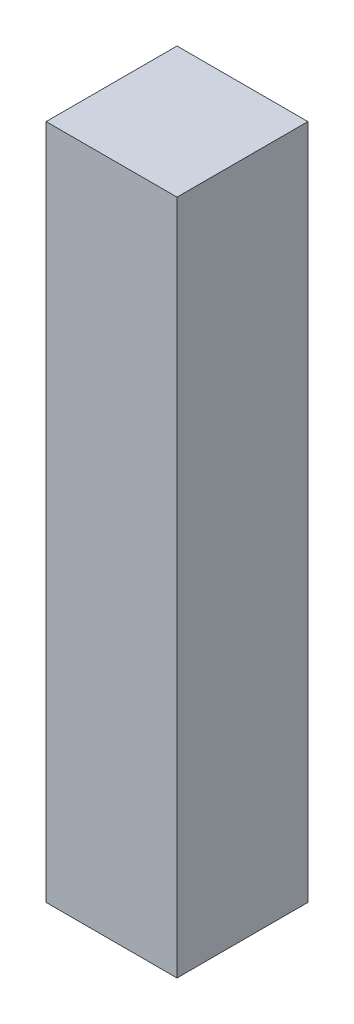
ISO-10303-21;
HEADER;
FILE_DESCRIPTION(('STEP AP214'),'2;1');
FILE_NAME('part.step','',(''),(''),'','','');
FILE_SCHEMA(('AUTOMOTIVE_DESIGN { 1 0 10303 214 1 1 1 1 }'));
ENDSEC;
DATA;
#1=APPLICATION_CONTEXT('core data for automotive mechanical design processes');
#2=APPLICATION_PROTOCOL_DEFINITION('international standard','automotive_design',2000,#1);
#3=PRODUCT_CONTEXT('',#1,'mechanical');
#4=PRODUCT('Part','Part','',(#3));
#5=PRODUCT_RELATED_PRODUCT_CATEGORY('part','',(#4));
#6=PRODUCT_DEFINITION_FORMATION('','',#4);
#7=PRODUCT_DEFINITION_CONTEXT('part definition',#1,'design');
#8=PRODUCT_DEFINITION('design','',#6,#7);
#9=PRODUCT_DEFINITION_SHAPE('','',#8);
#10=(LENGTH_UNIT() NAMED_UNIT(*) SI_UNIT(.MILLI.,.METRE.));
#11=(NAMED_UNIT(*) PLANE_ANGLE_UNIT() SI_UNIT($,.RADIAN.));
#12=(NAMED_UNIT(*) SI_UNIT($,.STERADIAN.) SOLID_ANGLE_UNIT());
#13=UNCERTAINTY_MEASURE_WITH_UNIT(LENGTH_MEASURE(1.E-05),#10,'distance_accuracy_value','');
#14=(GEOMETRIC_REPRESENTATION_CONTEXT(3) GLOBAL_UNCERTAINTY_ASSIGNED_CONTEXT((#13)) GLOBAL_UNIT_ASSIGNED_CONTEXT((#10,
#11,#12)) REPRESENTATION_CONTEXT('',''));
#15=CARTESIAN_POINT('',(0.,0.,0.));
#16=DIRECTION('',(0.,0.,1.));
#17=DIRECTION('',(1.,0.,0.));
#18=AXIS2_PLACEMENT_3D('',#15,#16,#17);
#19=CARTESIAN_POINT('',(0.,98.425,0.));
#20=DIRECTION('',(1.,0.,0.));
#21=DIRECTION('',(0.,0.,-1.));
#22=AXIS2_PLACEMENT_3D('',#19,#20,#21);
#23=PLANE('',#22);
#24=DIRECTION('',(0.,0.,1.));
#25=VECTOR('',#24,1.);
#26=CARTESIAN_POINT('',(0.,0.,0.));
#27=LINE('',#26,#25);
#28=CARTESIAN_POINT('',(0.,0.,-19.05));
#29=VERTEX_POINT('',#28);
#30=CARTESIAN_POINT('',(0.,0.,0.));
#31=VERTEX_POINT('',#30);
#32=EDGE_CURVE('E98',#29,#31,#27,.T.);
#33=ORIENTED_EDGE('',*,*,#32,.T.);
#34=DIRECTION('',(0.,-1.,0.));
#35=VECTOR('',#34,1.);
#36=CARTESIAN_POINT('',(0.,98.425,0.));
#37=LINE('',#36,#35);
#38=CARTESIAN_POINT('',(0.,98.425,0.));
#39=VERTEX_POINT('',#38);
#40=EDGE_CURVE('E11',#39,#31,#37,.T.);
#41=ORIENTED_EDGE('',*,*,#40,.F.);
#42=DIRECTION('',(0.,0.,1.));
#43=VECTOR('',#42,1.);
#44=CARTESIAN_POINT('',(0.,98.425,0.));
#45=LINE('',#44,#43);
#46=CARTESIAN_POINT('',(0.,98.425,-19.05));
#47=VERTEX_POINT('',#46);
#48=EDGE_CURVE('E86',#47,#39,#45,.T.);
#49=ORIENTED_EDGE('',*,*,#48,.F.);
#50=DIRECTION('',(0.,-1.,0.));
#51=VECTOR('',#50,1.);
#52=CARTESIAN_POINT('',(0.,98.425,-19.05));
#53=LINE('',#52,#51);
#54=EDGE_CURVE('E94',#47,#29,#53,.T.);
#55=ORIENTED_EDGE('',*,*,#54,.T.);
#56=EDGE_LOOP('',(#33,#41,#49,#55));
#57=FACE_BOUND('',#56,.T.);
#58=ADVANCED_FACE('F35',(#57),#23,.F.);
#59=CARTESIAN_POINT('',(0.,98.425,0.));
#60=DIRECTION('',(0.,0.,-1.));
#61=DIRECTION('',(-1.,0.,0.));
#62=AXIS2_PLACEMENT_3D('',#59,#60,#61);
#63=PLANE('',#62);
#64=DIRECTION('',(1.,0.,0.));
#65=VECTOR('',#64,1.);
#66=CARTESIAN_POINT('',(0.,0.,0.));
#67=LINE('',#66,#65);
#68=CARTESIAN_POINT('',(19.05,0.,0.));
#69=VERTEX_POINT('',#68);
#70=EDGE_CURVE('E90',#31,#69,#67,.T.);
#71=ORIENTED_EDGE('',*,*,#70,.T.);
#72=DIRECTION('',(0.,-1.,0.));
#73=VECTOR('',#72,1.);
#74=CARTESIAN_POINT('',(19.05,98.425,0.));
#75=LINE('',#74,#73);
#76=CARTESIAN_POINT('',(19.05,98.425,0.));
#77=VERTEX_POINT('',#76);
#78=EDGE_CURVE('E43',#77,#69,#75,.T.);
#79=ORIENTED_EDGE('',*,*,#78,.F.);
#80=DIRECTION('',(1.,0.,0.));
#81=VECTOR('',#80,1.);
#82=CARTESIAN_POINT('',(0.,98.425,0.));
#83=LINE('',#82,#81);
#84=EDGE_CURVE('E81',#39,#77,#83,.T.);
#85=ORIENTED_EDGE('',*,*,#84,.F.);
#86=ORIENTED_EDGE('',*,*,#40,.T.);
#87=EDGE_LOOP('',(#71,#79,#85,#86));
#88=FACE_BOUND('',#87,.T.);
#89=ADVANCED_FACE('F89',(#88),#63,.F.);
#90=CARTESIAN_POINT('',(19.05,98.425,0.));
#91=DIRECTION('',(-1.,0.,0.));
#92=DIRECTION('',(0.,0.,1.));
#93=AXIS2_PLACEMENT_3D('',#90,#91,#92);
#94=PLANE('',#93);
#95=DIRECTION('',(0.,0.,-1.));
#96=VECTOR('',#95,1.);
#97=CARTESIAN_POINT('',(19.05,0.,0.));
#98=LINE('',#97,#96);
#99=CARTESIAN_POINT('',(19.05,0.,-19.05));
#100=VERTEX_POINT('',#99);
#101=EDGE_CURVE('E68',#69,#100,#98,.T.);
#102=ORIENTED_EDGE('',*,*,#101,.T.);
#103=DIRECTION('',(0.,-1.,0.));
#104=VECTOR('',#103,1.);
#105=CARTESIAN_POINT('',(19.05,98.425,-19.05));
#106=LINE('',#105,#104);
#107=CARTESIAN_POINT('',(19.05,98.425,-19.05));
#108=VERTEX_POINT('',#107);
#109=EDGE_CURVE('E91',#108,#100,#106,.T.);
#110=ORIENTED_EDGE('',*,*,#109,.F.);
#111=DIRECTION('',(0.,0.,-1.));
#112=VECTOR('',#111,1.);
#113=CARTESIAN_POINT('',(19.05,98.425,0.));
#114=LINE('',#113,#112);
#115=EDGE_CURVE('E84',#77,#108,#114,.T.);
#116=ORIENTED_EDGE('',*,*,#115,.F.);
#117=ORIENTED_EDGE('',*,*,#78,.T.);
#118=EDGE_LOOP('',(#102,#110,#116,#117));
#119=FACE_BOUND('',#118,.T.);
#120=ADVANCED_FACE('F92',(#119),#94,.F.);
#121=CARTESIAN_POINT('',(0.,98.425,-19.05));
#122=DIRECTION('',(0.,0.,1.));
#123=DIRECTION('',(1.,0.,0.));
#124=AXIS2_PLACEMENT_3D('',#121,#122,#123);
#125=PLANE('',#124);
#126=DIRECTION('',(-1.,0.,0.));
#127=VECTOR('',#126,1.);
#128=CARTESIAN_POINT('',(0.,0.,-19.05));
#129=LINE('',#128,#127);
#130=EDGE_CURVE('E74',#100,#29,#129,.T.);
#131=ORIENTED_EDGE('',*,*,#130,.T.);
#132=ORIENTED_EDGE('',*,*,#54,.F.);
#133=DIRECTION('',(-1.,0.,0.));
#134=VECTOR('',#133,1.);
#135=CARTESIAN_POINT('',(0.,98.425,-19.05));
#136=LINE('',#135,#134);
#137=EDGE_CURVE('E51',#108,#47,#136,.T.);
#138=ORIENTED_EDGE('',*,*,#137,.F.);
#139=ORIENTED_EDGE('',*,*,#109,.T.);
#140=EDGE_LOOP('',(#131,#132,#138,#139));
#141=FACE_BOUND('',#140,.T.);
#142=ADVANCED_FACE('F105',(#141),#125,.F.);
#143=CARTESIAN_POINT('',(0.,98.425,0.));
#144=DIRECTION('',(0.,-1.,0.));
#145=DIRECTION('',(0.,0.,-1.));
#146=AXIS2_PLACEMENT_3D('',#143,#144,#145);
#147=PLANE('',#146);
#148=ORIENTED_EDGE('',*,*,#48,.T.);
#149=ORIENTED_EDGE('',*,*,#84,.T.);
#150=ORIENTED_EDGE('',*,*,#115,.T.);
#151=ORIENTED_EDGE('',*,*,#137,.T.);
#152=EDGE_LOOP('',(#148,#149,#150,#151));
#153=FACE_BOUND('',#152,.T.);
#154=ADVANCED_FACE('F82',(#153),#147,.F.);
#155=CARTESIAN_POINT('',(0.,0.,0.));
#156=DIRECTION('',(0.,-1.,0.));
#157=DIRECTION('',(0.,0.,-1.));
#158=AXIS2_PLACEMENT_3D('',#155,#156,#157);
#159=PLANE('',#158);
#160=ORIENTED_EDGE('',*,*,#32,.F.);
#161=ORIENTED_EDGE('',*,*,#130,.F.);
#162=ORIENTED_EDGE('',*,*,#101,.F.);
#163=ORIENTED_EDGE('',*,*,#70,.F.);
#164=EDGE_LOOP('',(#160,#161,#162,#163));
#165=FACE_BOUND('',#164,.T.);
#166=ADVANCED_FACE('F108',(#165),#159,.T.);
#167=CLOSED_SHELL('',(#58,#89,#120,#142,#154,#166));
#168=MANIFOLD_SOLID_BREP('B2',#167);
#169=ADVANCED_BREP_SHAPE_REPRESENTATION('',(#18,#168),#14);
#170=SHAPE_DEFINITION_REPRESENTATION(#9,#169);
ENDSEC;
END-ISO-10303-21;
